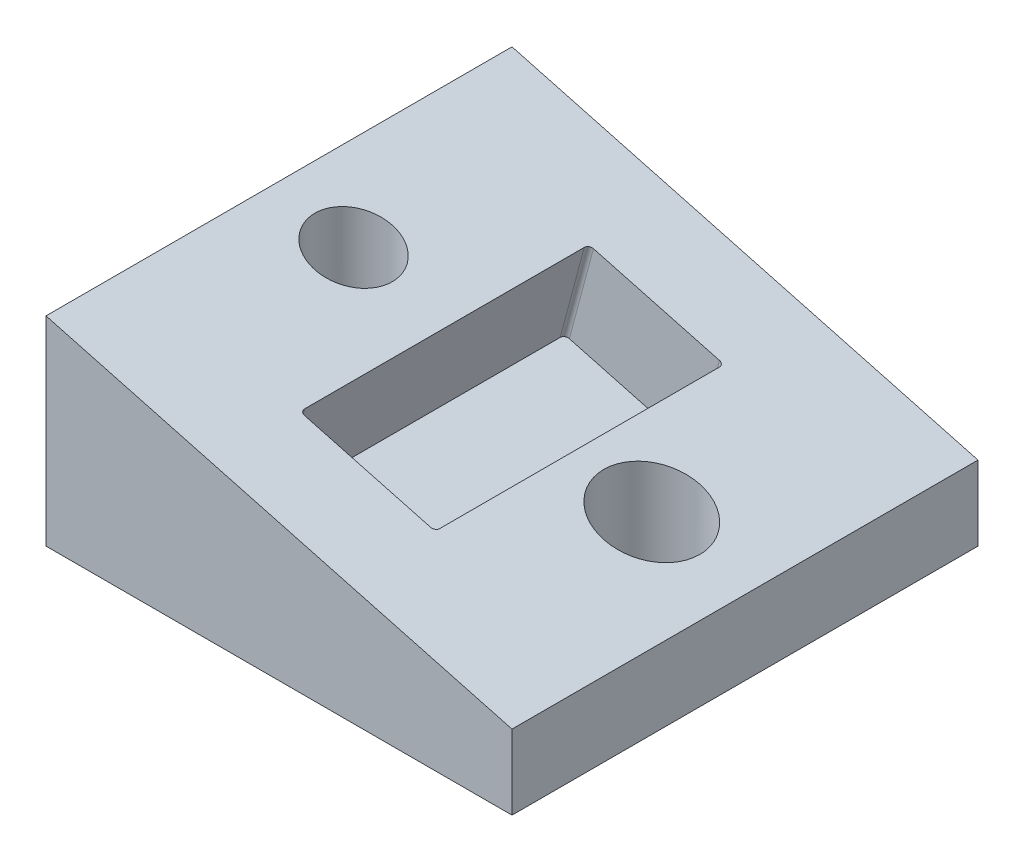
ISO-10303-21;
HEADER;
FILE_DESCRIPTION(('STEP AP214'),'2;1');
FILE_NAME('part.step','',(''),(''),'','','');
FILE_SCHEMA(('AUTOMOTIVE_DESIGN { 1 0 10303 214 1 1 1 1 }'));
ENDSEC;
DATA;
#1=APPLICATION_CONTEXT('core data for automotive mechanical design processes');
#2=APPLICATION_PROTOCOL_DEFINITION('international standard','automotive_design',2000,#1);
#3=PRODUCT_CONTEXT('',#1,'mechanical');
#4=PRODUCT('Part','Part','',(#3));
#5=PRODUCT_RELATED_PRODUCT_CATEGORY('part','',(#4));
#6=PRODUCT_DEFINITION_FORMATION('','',#4);
#7=PRODUCT_DEFINITION_CONTEXT('part definition',#1,'design');
#8=PRODUCT_DEFINITION('design','',#6,#7);
#9=PRODUCT_DEFINITION_SHAPE('','',#8);
#10=(LENGTH_UNIT() NAMED_UNIT(*) SI_UNIT(.MILLI.,.METRE.));
#11=(NAMED_UNIT(*) PLANE_ANGLE_UNIT() SI_UNIT($,.RADIAN.));
#12=(NAMED_UNIT(*) SI_UNIT($,.STERADIAN.) SOLID_ANGLE_UNIT());
#13=UNCERTAINTY_MEASURE_WITH_UNIT(LENGTH_MEASURE(1.E-05),#10,'distance_accuracy_value','');
#14=(GEOMETRIC_REPRESENTATION_CONTEXT(3) GLOBAL_UNCERTAINTY_ASSIGNED_CONTEXT((#13)) GLOBAL_UNIT_ASSIGNED_CONTEXT((#10,
#11,#12)) REPRESENTATION_CONTEXT('',''));
#15=CARTESIAN_POINT('',(0.,0.,0.));
#16=DIRECTION('',(0.,0.,1.));
#17=DIRECTION('',(1.,0.,0.));
#18=AXIS2_PLACEMENT_3D('',#15,#16,#17);
#19=CARTESIAN_POINT('',(-25.,0.,50.));
#20=DIRECTION('',(-1.,0.,0.));
#21=DIRECTION('',(0.,0.,1.));
#22=AXIS2_PLACEMENT_3D('',#19,#20,#21);
#23=PLANE('',#22);
#24=DIRECTION('',(0.,1.,0.));
#25=VECTOR('',#24,1.);
#26=CARTESIAN_POINT('',(-25.,0.,0.));
#27=LINE('',#26,#25);
#28=CARTESIAN_POINT('',(-25.,-4.,0.));
#29=VERTEX_POINT('',#28);
#30=CARTESIAN_POINT('',(-25.,17.3974596215558,0.));
#31=VERTEX_POINT('',#30);
#32=EDGE_CURVE('E134',#29,#31,#27,.T.);
#33=ORIENTED_EDGE('',*,*,#32,.F.);
#34=DIRECTION('',(0.,0.,-1.));
#35=VECTOR('',#34,1.);
#36=CARTESIAN_POINT('',(-25.,-4.,50.));
#37=LINE('',#36,#35);
#38=CARTESIAN_POINT('',(-25.,-4.,50.));
#39=VERTEX_POINT('',#38);
#40=EDGE_CURVE('E129',#39,#29,#37,.T.);
#41=ORIENTED_EDGE('',*,*,#40,.F.);
#42=DIRECTION('',(0.,1.,0.));
#43=VECTOR('',#42,1.);
#44=CARTESIAN_POINT('',(-25.,0.,50.));
#45=LINE('',#44,#43);
#46=CARTESIAN_POINT('',(-25.,17.3974596215558,50.));
#47=VERTEX_POINT('',#46);
#48=EDGE_CURVE('E132',#39,#47,#45,.T.);
#49=ORIENTED_EDGE('',*,*,#48,.T.);
#50=DIRECTION('',(0.,0.,-1.));
#51=VECTOR('',#50,1.);
#52=CARTESIAN_POINT('',(-25.,17.3974596215558,50.));
#53=LINE('',#52,#51);
#54=EDGE_CURVE('E170',#47,#31,#53,.T.);
#55=ORIENTED_EDGE('',*,*,#54,.T.);
#56=EDGE_LOOP('',(#33,#41,#49,#55));
#57=FACE_BOUND('',#56,.T.);
#58=ADVANCED_FACE('F40',(#57),#23,.T.);
#59=CARTESIAN_POINT('',(0.,-4.,50.));
#60=DIRECTION('',(0.,1.,0.));
#61=DIRECTION('',(0.,0.,1.));
#62=AXIS2_PLACEMENT_3D('',#59,#60,#61);
#63=PLANE('',#62);
#64=CARTESIAN_POINT('',(15.,-4.,25.));
#65=DIRECTION('',(0.,-1.,0.));
#66=DIRECTION('',(0.,0.,-1.));
#67=AXIS2_PLACEMENT_3D('',#64,#65,#66);
#68=CIRCLE('',#67,5.15);
#69=CARTESIAN_POINT('',(15.,-4.,19.85));
#70=VERTEX_POINT('',#69);
#71=EDGE_CURVE('E191',#70,#70,#68,.T.);
#72=ORIENTED_EDGE('',*,*,#71,.F.);
#73=EDGE_LOOP('',(#72));
#74=FACE_BOUND('',#73,.T.);
#75=CARTESIAN_POINT('',(-17.,-4.,25.));
#76=DIRECTION('',(0.,-1.,0.));
#77=DIRECTION('',(0.,0.,-1.));
#78=AXIS2_PLACEMENT_3D('',#75,#76,#77);
#79=CIRCLE('',#78,4.15);
#80=CARTESIAN_POINT('',(-17.,-4.,20.85));
#81=VERTEX_POINT('',#80);
#82=EDGE_CURVE('E163',#81,#81,#79,.T.);
#83=ORIENTED_EDGE('',*,*,#82,.F.);
#84=EDGE_LOOP('',(#83));
#85=FACE_BOUND('',#84,.T.);
#86=DIRECTION('',(1.,0.,0.));
#87=VECTOR('',#86,1.);
#88=CARTESIAN_POINT('',(0.,-4.,0.));
#89=LINE('',#88,#87);
#90=CARTESIAN_POINT('',(25.,-4.,0.));
#91=VERTEX_POINT('',#90);
#92=EDGE_CURVE('E173',#29,#91,#89,.T.);
#93=ORIENTED_EDGE('',*,*,#92,.T.);
#94=DIRECTION('',(0.,0.,-1.));
#95=VECTOR('',#94,1.);
#96=CARTESIAN_POINT('',(25.,-4.,50.));
#97=LINE('',#96,#95);
#98=CARTESIAN_POINT('',(25.,-4.,50.));
#99=VERTEX_POINT('',#98);
#100=EDGE_CURVE('E140',#99,#91,#97,.T.);
#101=ORIENTED_EDGE('',*,*,#100,.F.);
#102=DIRECTION('',(1.,0.,0.));
#103=VECTOR('',#102,1.);
#104=CARTESIAN_POINT('',(0.,-4.,50.));
#105=LINE('',#104,#103);
#106=EDGE_CURVE('E143',#39,#99,#105,.T.);
#107=ORIENTED_EDGE('',*,*,#106,.F.);
#108=ORIENTED_EDGE('',*,*,#40,.T.);
#109=EDGE_LOOP('',(#93,#101,#107,#108));
#110=FACE_BOUND('',#109,.T.);
#111=ADVANCED_FACE('F144',(#74,#85,#110),#63,.F.);
#112=CARTESIAN_POINT('',(25.,0.,50.));
#113=DIRECTION('',(1.,0.,0.));
#114=DIRECTION('',(0.,0.,-1.));
#115=AXIS2_PLACEMENT_3D('',#112,#113,#114);
#116=PLANE('',#115);
#117=DIRECTION('',(0.,-1.,0.));
#118=VECTOR('',#117,1.);
#119=CARTESIAN_POINT('',(25.,0.,0.));
#120=LINE('',#119,#118);
#121=CARTESIAN_POINT('',(25.,4.,0.));
#122=VERTEX_POINT('',#121);
#123=EDGE_CURVE('E160',#122,#91,#120,.T.);
#124=ORIENTED_EDGE('',*,*,#123,.F.);
#125=DIRECTION('',(0.,0.,-1.));
#126=VECTOR('',#125,1.);
#127=CARTESIAN_POINT('',(25.,4.,50.));
#128=LINE('',#127,#126);
#129=CARTESIAN_POINT('',(25.,4.,50.));
#130=VERTEX_POINT('',#129);
#131=EDGE_CURVE('E182',#130,#122,#128,.T.);
#132=ORIENTED_EDGE('',*,*,#131,.F.);
#133=DIRECTION('',(0.,-1.,0.));
#134=VECTOR('',#133,1.);
#135=CARTESIAN_POINT('',(25.,0.,50.));
#136=LINE('',#135,#134);
#137=EDGE_CURVE('E149',#130,#99,#136,.T.);
#138=ORIENTED_EDGE('',*,*,#137,.T.);
#139=ORIENTED_EDGE('',*,*,#100,.T.);
#140=EDGE_LOOP('',(#124,#132,#138,#139));
#141=FACE_BOUND('',#140,.T.);
#142=ADVANCED_FACE('F296',(#141),#116,.T.);
#143=CARTESIAN_POINT('',(2.67468245269441,9.98205080756874,50.));
#144=DIRECTION('',(-0.258819045102514,-0.96592582628907,0.));
#145=DIRECTION('',(0.96592582628907,-0.258819045102514,0.));
#146=AXIS2_PLACEMENT_3D('',#143,#144,#145);
#147=PLANE('',#146);
#148=DIRECTION('',(0.,0.,1.));
#149=VECTOR('',#148,1.);
#150=CARTESIAN_POINT('',(-7.24260408152916,12.6393797255219,9.5));
#151=LINE('',#150,#149);
#152=CARTESIAN_POINT('',(-7.24260408152916,12.6393797255219,10.));
#153=VERTEX_POINT('',#152);
#154=CARTESIAN_POINT('',(-7.24260408152915,12.6393797255219,40.));
#155=VERTEX_POINT('',#154);
#156=EDGE_CURVE('E256',#153,#155,#151,.T.);
#157=ORIENTED_EDGE('',*,*,#156,.F.);
#158=CARTESIAN_POINT('',(-6.75964116838462,12.5099702029707,10.));
#159=DIRECTION('',(-0.258819045102514,-0.96592582628907,0.));
#160=DIRECTION('',(0.96592582628907,-0.258819045102514,0.));
#161=AXIS2_PLACEMENT_3D('',#158,#159,#160);
#162=CIRCLE('',#161,0.5);
#163=CARTESIAN_POINT('',(-6.75964116838462,12.5099702029707,9.5));
#164=VERTEX_POINT('',#163);
#165=EDGE_CURVE('E49',#153,#164,#162,.T.);
#166=ORIENTED_EDGE('',*,*,#165,.T.);
#167=DIRECTION('',(-0.96592582628907,0.258819045102514,0.));
#168=VECTOR('',#167,1.);
#169=CARTESIAN_POINT('',(7.2462833128069,8.75709404898421,9.49999999999999));
#170=LINE('',#169,#168);
#171=CARTESIAN_POINT('',(6.76332039966236,8.88650357153547,9.49999999999999));
#172=VERTEX_POINT('',#171);
#173=EDGE_CURVE('E279',#172,#164,#170,.T.);
#174=ORIENTED_EDGE('',*,*,#173,.F.);
#175=CARTESIAN_POINT('',(6.76332039966236,8.88650357153547,9.99999999999999));
#176=DIRECTION('',(-0.258819045102514,-0.96592582628907,0.));
#177=DIRECTION('',(0.96592582628907,-0.258819045102514,0.));
#178=AXIS2_PLACEMENT_3D('',#175,#176,#177);
#179=CIRCLE('',#178,0.5);
#180=CARTESIAN_POINT('',(7.2462833128069,8.75709404898421,9.99999999999999));
#181=VERTEX_POINT('',#180);
#182=EDGE_CURVE('E11',#172,#181,#179,.T.);
#183=ORIENTED_EDGE('',*,*,#182,.T.);
#184=DIRECTION('',(0.,0.,-1.));
#185=VECTOR('',#184,1.);
#186=CARTESIAN_POINT('',(7.2462833128069,8.75709404898421,40.5));
#187=LINE('',#186,#185);
#188=CARTESIAN_POINT('',(7.2462833128069,8.75709404898421,40.));
#189=VERTEX_POINT('',#188);
#190=EDGE_CURVE('E246',#189,#181,#187,.T.);
#191=ORIENTED_EDGE('',*,*,#190,.F.);
#192=CARTESIAN_POINT('',(6.76332039966236,8.88650357153547,40.));
#193=DIRECTION('',(-0.258819045102514,-0.96592582628907,0.));
#194=DIRECTION('',(0.96592582628907,-0.258819045102514,0.));
#195=AXIS2_PLACEMENT_3D('',#192,#193,#194);
#196=CIRCLE('',#195,0.5);
#197=CARTESIAN_POINT('',(6.76332039966236,8.88650357153547,40.5));
#198=VERTEX_POINT('',#197);
#199=EDGE_CURVE('E236',#189,#198,#196,.T.);
#200=ORIENTED_EDGE('',*,*,#199,.T.);
#201=DIRECTION('',(0.96592582628907,-0.258819045102514,0.));
#202=VECTOR('',#201,1.);
#203=CARTESIAN_POINT('',(7.2462833128069,8.75709404898421,40.5));
#204=LINE('',#203,#202);
#205=CARTESIAN_POINT('',(-6.75964116838461,12.5099702029707,40.5));
#206=VERTEX_POINT('',#205);
#207=EDGE_CURVE('E244',#206,#198,#204,.T.);
#208=ORIENTED_EDGE('',*,*,#207,.F.);
#209=CARTESIAN_POINT('',(-6.75964116838461,12.5099702029707,40.));
#210=DIRECTION('',(-0.258819045102514,-0.96592582628907,0.));
#211=DIRECTION('',(0.96592582628907,-0.258819045102514,0.));
#212=AXIS2_PLACEMENT_3D('',#209,#210,#211);
#213=CIRCLE('',#212,0.5);
#214=EDGE_CURVE('E233',#206,#155,#213,.T.);
#215=ORIENTED_EDGE('',*,*,#214,.T.);
#216=EDGE_LOOP('',(#157,#166,#174,#183,#191,#200,#208,#215));
#217=FACE_BOUND('',#216,.T.);
#218=CARTESIAN_POINT('',(15.,6.67949192431115,25.));
#219=DIRECTION('',(-0.258819045102514,-0.96592582628907,0.));
#220=DIRECTION('',(0.96592582628907,-0.258819045102514,0.));
#221=AXIS2_PLACEMENT_3D('',#218,#219,#220);
#222=ELLIPSE('',#221,5.33167232911192,5.15);
#223=CARTESIAN_POINT('',(20.15,5.29955358329091,25.));
#224=VERTEX_POINT('',#223);
#225=EDGE_CURVE('E174',#224,#224,#222,.T.);
#226=ORIENTED_EDGE('',*,*,#225,.T.);
#227=EDGE_LOOP('',(#226));
#228=FACE_BOUND('',#227,.T.);
#229=CARTESIAN_POINT('',(-17.,15.2538660821068,25.));
#230=DIRECTION('',(-0.258819045102514,-0.96592582628907,0.));
#231=DIRECTION('',(0.96592582628907,-0.258819045102514,0.));
#232=AXIS2_PLACEMENT_3D('',#229,#230,#231);
#233=ELLIPSE('',#232,4.29639614870184,4.15);
#234=CARTESIAN_POINT('',(-12.85,14.1418769335177,25.));
#235=VERTEX_POINT('',#234);
#236=EDGE_CURVE('E187',#235,#235,#233,.T.);
#237=ORIENTED_EDGE('',*,*,#236,.T.);
#238=EDGE_LOOP('',(#237));
#239=FACE_BOUND('',#238,.T.);
#240=DIRECTION('',(-0.96592582628907,0.258819045102514,0.));
#241=VECTOR('',#240,1.);
#242=CARTESIAN_POINT('',(2.67468245269441,9.98205080756874,0.));
#243=LINE('',#242,#241);
#244=EDGE_CURVE('E156',#122,#31,#243,.T.);
#245=ORIENTED_EDGE('',*,*,#244,.T.);
#246=ORIENTED_EDGE('',*,*,#54,.F.);
#247=DIRECTION('',(-0.96592582628907,0.258819045102514,0.));
#248=VECTOR('',#247,1.);
#249=CARTESIAN_POINT('',(2.67468245269441,9.98205080756874,50.));
#250=LINE('',#249,#248);
#251=EDGE_CURVE('E153',#130,#47,#250,.T.);
#252=ORIENTED_EDGE('',*,*,#251,.F.);
#253=ORIENTED_EDGE('',*,*,#131,.T.);
#254=EDGE_LOOP('',(#245,#246,#252,#253));
#255=FACE_BOUND('',#254,.T.);
#256=ADVANCED_FACE('F242',(#217,#228,#239,#255),#147,.F.);
#257=CARTESIAN_POINT('',(0.,0.,50.));
#258=DIRECTION('',(0.,0.,1.));
#259=DIRECTION('',(1.,0.,0.));
#260=AXIS2_PLACEMENT_3D('',#257,#258,#259);
#261=PLANE('',#260);
#262=ORIENTED_EDGE('',*,*,#48,.F.);
#263=ORIENTED_EDGE('',*,*,#106,.T.);
#264=ORIENTED_EDGE('',*,*,#137,.F.);
#265=ORIENTED_EDGE('',*,*,#251,.T.);
#266=EDGE_LOOP('',(#262,#263,#264,#265));
#267=FACE_BOUND('',#266,.T.);
#268=ADVANCED_FACE('F151',(#267),#261,.T.);
#269=CARTESIAN_POINT('',(0.,0.,0.));
#270=DIRECTION('',(0.,0.,1.));
#271=DIRECTION('',(1.,0.,0.));
#272=AXIS2_PLACEMENT_3D('',#269,#270,#271);
#273=PLANE('',#272);
#274=ORIENTED_EDGE('',*,*,#32,.T.);
#275=ORIENTED_EDGE('',*,*,#244,.F.);
#276=ORIENTED_EDGE('',*,*,#123,.T.);
#277=ORIENTED_EDGE('',*,*,#92,.F.);
#278=EDGE_LOOP('',(#274,#275,#276,#277));
#279=FACE_BOUND('',#278,.T.);
#280=ADVANCED_FACE('F303',(#279),#273,.F.);
#281=CARTESIAN_POINT('',(-17.,46.,25.));
#282=DIRECTION('',(0.,-1.,0.));
#283=DIRECTION('',(0.,0.,-1.));
#284=AXIS2_PLACEMENT_3D('',#281,#282,#283);
#285=CYLINDRICAL_SURFACE('',#284,4.15);
#286=ORIENTED_EDGE('',*,*,#82,.T.);
#287=EDGE_LOOP('',(#286));
#288=FACE_BOUND('',#287,.T.);
#289=ORIENTED_EDGE('',*,*,#236,.F.);
#290=EDGE_LOOP('',(#289));
#291=FACE_BOUND('',#290,.T.);
#292=ADVANCED_FACE('F300',(#288,#291),#285,.F.);
#293=CARTESIAN_POINT('',(15.,46.,25.));
#294=DIRECTION('',(0.,-1.,0.));
#295=DIRECTION('',(0.,0.,-1.));
#296=AXIS2_PLACEMENT_3D('',#293,#294,#295);
#297=CYLINDRICAL_SURFACE('',#296,5.15);
#298=ORIENTED_EDGE('',*,*,#71,.T.);
#299=EDGE_LOOP('',(#298));
#300=FACE_BOUND('',#299,.T.);
#301=ORIENTED_EDGE('',*,*,#225,.F.);
#302=EDGE_LOOP('',(#301));
#303=FACE_BOUND('',#302,.T.);
#304=ADVANCED_FACE('F291',(#300,#303),#297,.F.);
#305=CARTESIAN_POINT('',(4.65809286178175,-0.90216421390649,9.49999999999999));
#306=DIRECTION('',(0.,0.,-1.));
#307=DIRECTION('',(-1.,0.,0.));
#308=AXIS2_PLACEMENT_3D('',#305,#306,#307);
#309=PLANE('',#308);
#310=ORIENTED_EDGE('',*,*,#173,.T.);
#311=DIRECTION('',(0.258819045102514,0.96592582628907,0.));
#312=VECTOR('',#311,1.);
#313=CARTESIAN_POINT('',(-9.34783161940976,2.85071194007996,9.5));
#314=LINE('',#313,#312);
#315=CARTESIAN_POINT('',(-9.34783161940976,2.85071194007997,9.5));
#316=VERTEX_POINT('',#315);
#317=EDGE_CURVE('E230',#164,#316,#314,.F.);
#318=ORIENTED_EDGE('',*,*,#317,.T.);
#319=DIRECTION('',(-0.96592582628907,0.258819045102514,0.));
#320=VECTOR('',#319,1.);
#321=CARTESIAN_POINT('',(4.65809286178175,-0.90216421390649,9.49999999999999));
#322=LINE('',#321,#320);
#323=CARTESIAN_POINT('',(4.17512994863722,-0.772754691355233,9.49999999999999));
#324=VERTEX_POINT('',#323);
#325=EDGE_CURVE('E286',#324,#316,#322,.T.);
#326=ORIENTED_EDGE('',*,*,#325,.F.);
#327=DIRECTION('',(0.258819045102514,0.96592582628907,0.));
#328=VECTOR('',#327,1.);
#329=CARTESIAN_POINT('',(6.76332039966236,8.88650357153547,9.49999999999999));
#330=LINE('',#329,#328);
#331=EDGE_CURVE('E227',#324,#172,#330,.T.);
#332=ORIENTED_EDGE('',*,*,#331,.T.);
#333=EDGE_LOOP('',(#310,#318,#326,#332));
#334=FACE_BOUND('',#333,.T.);
#335=ADVANCED_FACE('F359',(#334),#309,.F.);
#336=CARTESIAN_POINT('',(4.65809286178175,-0.90216421390649,40.5));
#337=DIRECTION('',(0.96592582628907,-0.258819045102514,0.));
#338=DIRECTION('',(0.258819045102514,0.96592582628907,0.));
#339=AXIS2_PLACEMENT_3D('',#336,#337,#338);
#340=PLANE('',#339);
#341=DIRECTION('',(0.,0.,-1.));
#342=VECTOR('',#341,1.);
#343=CARTESIAN_POINT('',(4.65809286178175,-0.90216421390649,40.5));
#344=LINE('',#343,#342);
#345=CARTESIAN_POINT('',(4.65809286178175,-0.90216421390649,40.));
#346=VERTEX_POINT('',#345);
#347=CARTESIAN_POINT('',(4.65809286178175,-0.90216421390649,9.99999999999999));
#348=VERTEX_POINT('',#347);
#349=EDGE_CURVE('E265',#346,#348,#344,.T.);
#350=ORIENTED_EDGE('',*,*,#349,.F.);
#351=DIRECTION('',(0.258819045102514,0.96592582628907,0.));
#352=VECTOR('',#351,1.);
#353=CARTESIAN_POINT('',(7.2462833128069,8.75709404898421,40.));
#354=LINE('',#353,#352);
#355=EDGE_CURVE('E223',#346,#189,#354,.T.);
#356=ORIENTED_EDGE('',*,*,#355,.T.);
#357=ORIENTED_EDGE('',*,*,#190,.T.);
#358=DIRECTION('',(0.258819045102514,0.96592582628907,0.));
#359=VECTOR('',#358,1.);
#360=CARTESIAN_POINT('',(4.65809286178175,-0.90216421390649,9.99999999999999));
#361=LINE('',#360,#359);
#362=EDGE_CURVE('E220',#181,#348,#361,.F.);
#363=ORIENTED_EDGE('',*,*,#362,.T.);
#364=EDGE_LOOP('',(#350,#356,#357,#363));
#365=FACE_BOUND('',#364,.T.);
#366=ADVANCED_FACE('F269',(#365),#340,.F.);
#367=CARTESIAN_POINT('',(4.65809286178175,-0.90216421390649,40.5));
#368=DIRECTION('',(0.,0.,1.));
#369=DIRECTION('',(1.,0.,0.));
#370=AXIS2_PLACEMENT_3D('',#367,#368,#369);
#371=PLANE('',#370);
#372=DIRECTION('',(0.96592582628907,-0.258819045102514,0.));
#373=VECTOR('',#372,1.);
#374=CARTESIAN_POINT('',(4.65809286178175,-0.90216421390649,40.5));
#375=LINE('',#374,#373);
#376=CARTESIAN_POINT('',(-9.34783161940975,2.85071194007996,40.5));
#377=VERTEX_POINT('',#376);
#378=CARTESIAN_POINT('',(4.17512994863722,-0.772754691355233,40.5));
#379=VERTEX_POINT('',#378);
#380=EDGE_CURVE('E267',#377,#379,#375,.T.);
#381=ORIENTED_EDGE('',*,*,#380,.F.);
#382=DIRECTION('',(0.258819045102514,0.96592582628907,0.));
#383=VECTOR('',#382,1.);
#384=CARTESIAN_POINT('',(-6.75964116838461,12.5099702029707,40.5));
#385=LINE('',#384,#383);
#386=EDGE_CURVE('E197',#377,#206,#385,.T.);
#387=ORIENTED_EDGE('',*,*,#386,.T.);
#388=ORIENTED_EDGE('',*,*,#207,.T.);
#389=DIRECTION('',(0.258819045102514,0.96592582628907,0.));
#390=VECTOR('',#389,1.);
#391=CARTESIAN_POINT('',(4.17512994863722,-0.772754691355233,40.5));
#392=LINE('',#391,#390);
#393=EDGE_CURVE('E139',#198,#379,#392,.F.);
#394=ORIENTED_EDGE('',*,*,#393,.T.);
#395=EDGE_LOOP('',(#381,#387,#388,#394));
#396=FACE_BOUND('',#395,.T.);
#397=ADVANCED_FACE('F252',(#396),#371,.F.);
#398=CARTESIAN_POINT('',(-9.8307945325543,2.98012146263122,9.5));
#399=DIRECTION('',(-0.96592582628907,0.258819045102514,0.));
#400=DIRECTION('',(-0.258819045102514,-0.96592582628907,0.));
#401=AXIS2_PLACEMENT_3D('',#398,#399,#400);
#402=PLANE('',#401);
#403=ORIENTED_EDGE('',*,*,#156,.T.);
#404=DIRECTION('',(0.258819045102514,0.96592582628907,0.));
#405=VECTOR('',#404,1.);
#406=CARTESIAN_POINT('',(-9.83079453255429,2.98012146263122,40.));
#407=LINE('',#406,#405);
#408=CARTESIAN_POINT('',(-9.83079453255429,2.98012146263122,40.));
#409=VERTEX_POINT('',#408);
#410=EDGE_CURVE('E205',#155,#409,#407,.F.);
#411=ORIENTED_EDGE('',*,*,#410,.T.);
#412=DIRECTION('',(0.,0.,1.));
#413=VECTOR('',#412,1.);
#414=CARTESIAN_POINT('',(-9.8307945325543,2.98012146263122,9.5));
#415=LINE('',#414,#413);
#416=CARTESIAN_POINT('',(-9.8307945325543,2.98012146263122,10.));
#417=VERTEX_POINT('',#416);
#418=EDGE_CURVE('E275',#417,#409,#415,.T.);
#419=ORIENTED_EDGE('',*,*,#418,.F.);
#420=DIRECTION('',(0.258819045102514,0.96592582628907,0.));
#421=VECTOR('',#420,1.);
#422=CARTESIAN_POINT('',(-7.24260408152915,12.6393797255219,10.));
#423=LINE('',#422,#421);
#424=EDGE_CURVE('E201',#417,#153,#423,.T.);
#425=ORIENTED_EDGE('',*,*,#424,.T.);
#426=EDGE_LOOP('',(#403,#411,#419,#425));
#427=FACE_BOUND('',#426,.T.);
#428=ADVANCED_FACE('F344',(#427),#402,.F.);
#429=CARTESIAN_POINT('',(0.0864920016692668,0.322792544678045,0.));
#430=DIRECTION('',(0.258819045102514,0.96592582628907,0.));
#431=DIRECTION('',(-0.96592582628907,0.258819045102514,0.));
#432=AXIS2_PLACEMENT_3D('',#429,#430,#431);
#433=PLANE('',#432);
#434=ORIENTED_EDGE('',*,*,#418,.T.);
#435=CARTESIAN_POINT('',(-9.34783161940975,2.85071194007996,40.));
#436=DIRECTION('',(0.258819045102514,0.96592582628907,0.));
#437=DIRECTION('',(-0.96592582628907,0.258819045102514,0.));
#438=AXIS2_PLACEMENT_3D('',#435,#436,#437);
#439=CIRCLE('',#438,0.5);
#440=EDGE_CURVE('E217',#409,#377,#439,.T.);
#441=ORIENTED_EDGE('',*,*,#440,.T.);
#442=ORIENTED_EDGE('',*,*,#380,.T.);
#443=CARTESIAN_POINT('',(4.17512994863722,-0.772754691355232,40.));
#444=DIRECTION('',(0.258819045102514,0.96592582628907,0.));
#445=DIRECTION('',(-0.96592582628907,0.258819045102514,0.));
#446=AXIS2_PLACEMENT_3D('',#443,#444,#445);
#447=CIRCLE('',#446,0.5);
#448=EDGE_CURVE('E214',#379,#346,#447,.T.);
#449=ORIENTED_EDGE('',*,*,#448,.T.);
#450=ORIENTED_EDGE('',*,*,#349,.T.);
#451=CARTESIAN_POINT('',(4.17512994863722,-0.772754691355232,9.99999999999999));
#452=DIRECTION('',(0.258819045102514,0.96592582628907,0.));
#453=DIRECTION('',(-0.96592582628907,0.258819045102514,0.));
#454=AXIS2_PLACEMENT_3D('',#451,#452,#453);
#455=CIRCLE('',#454,0.5);
#456=EDGE_CURVE('E208',#348,#324,#455,.T.);
#457=ORIENTED_EDGE('',*,*,#456,.T.);
#458=ORIENTED_EDGE('',*,*,#325,.T.);
#459=CARTESIAN_POINT('',(-9.34783161940976,2.85071194007997,10.));
#460=DIRECTION('',(0.258819045102514,0.96592582628907,0.));
#461=DIRECTION('',(-0.96592582628907,0.258819045102514,0.));
#462=AXIS2_PLACEMENT_3D('',#459,#460,#461);
#463=CIRCLE('',#462,0.5);
#464=EDGE_CURVE('E211',#316,#417,#463,.T.);
#465=ORIENTED_EDGE('',*,*,#464,.T.);
#466=EDGE_LOOP('',(#434,#441,#442,#449,#450,#457,#458,#465));
#467=FACE_BOUND('',#466,.T.);
#468=ADVANCED_FACE('F264',(#467),#433,.T.);
#469=CARTESIAN_POINT('',(-9.34783161940975,2.85071194007996,40.));
#470=DIRECTION('',(-0.258819045102514,-0.96592582628907,0.));
#471=DIRECTION('',(0.96592582628907,-0.258819045102514,0.));
#472=AXIS2_PLACEMENT_3D('',#469,#470,#471);
#473=CYLINDRICAL_SURFACE('',#472,0.5);
#474=ORIENTED_EDGE('',*,*,#440,.F.);
#475=ORIENTED_EDGE('',*,*,#410,.F.);
#476=ORIENTED_EDGE('',*,*,#214,.F.);
#477=ORIENTED_EDGE('',*,*,#386,.F.);
#478=EDGE_LOOP('',(#474,#475,#476,#477));
#479=FACE_BOUND('',#478,.T.);
#480=ADVANCED_FACE('F325',(#479),#473,.F.);
#481=CARTESIAN_POINT('',(4.17512994863722,-0.772754691355233,40.));
#482=DIRECTION('',(-0.258819045102514,-0.96592582628907,0.));
#483=DIRECTION('',(0.96592582628907,-0.258819045102514,0.));
#484=AXIS2_PLACEMENT_3D('',#481,#482,#483);
#485=CYLINDRICAL_SURFACE('',#484,0.5);
#486=ORIENTED_EDGE('',*,*,#448,.F.);
#487=ORIENTED_EDGE('',*,*,#393,.F.);
#488=ORIENTED_EDGE('',*,*,#199,.F.);
#489=ORIENTED_EDGE('',*,*,#355,.F.);
#490=EDGE_LOOP('',(#486,#487,#488,#489));
#491=FACE_BOUND('',#490,.T.);
#492=ADVANCED_FACE('F259',(#491),#485,.F.);
#493=CARTESIAN_POINT('',(-9.34783161940976,2.85071194007996,10.));
#494=DIRECTION('',(-0.258819045102514,-0.96592582628907,0.));
#495=DIRECTION('',(0.96592582628907,-0.258819045102514,0.));
#496=AXIS2_PLACEMENT_3D('',#493,#494,#495);
#497=CYLINDRICAL_SURFACE('',#496,0.5);
#498=ORIENTED_EDGE('',*,*,#464,.F.);
#499=ORIENTED_EDGE('',*,*,#317,.F.);
#500=ORIENTED_EDGE('',*,*,#165,.F.);
#501=ORIENTED_EDGE('',*,*,#424,.F.);
#502=EDGE_LOOP('',(#498,#499,#500,#501));
#503=FACE_BOUND('',#502,.T.);
#504=ADVANCED_FACE('F330',(#503),#497,.F.);
#505=CARTESIAN_POINT('',(4.17512994863722,-0.772754691355233,9.99999999999999));
#506=DIRECTION('',(-0.258819045102514,-0.96592582628907,0.));
#507=DIRECTION('',(0.96592582628907,-0.258819045102514,0.));
#508=AXIS2_PLACEMENT_3D('',#505,#506,#507);
#509=CYLINDRICAL_SURFACE('',#508,0.5);
#510=ORIENTED_EDGE('',*,*,#456,.F.);
#511=ORIENTED_EDGE('',*,*,#362,.F.);
#512=ORIENTED_EDGE('',*,*,#182,.F.);
#513=ORIENTED_EDGE('',*,*,#331,.F.);
#514=EDGE_LOOP('',(#510,#511,#512,#513));
#515=FACE_BOUND('',#514,.T.);
#516=ADVANCED_FACE('F42',(#515),#509,.F.);
#517=CLOSED_SHELL('',(#58,#111,#142,#256,#268,#280,#292,#304,#335,#366,#397,#428,#468,#480,#492,
#504,#516));
#518=MANIFOLD_SOLID_BREP('B2',#517);
#519=ADVANCED_BREP_SHAPE_REPRESENTATION('',(#18,#518),#14);
#520=SHAPE_DEFINITION_REPRESENTATION(#9,#519);
ENDSEC;
END-ISO-10303-21;
